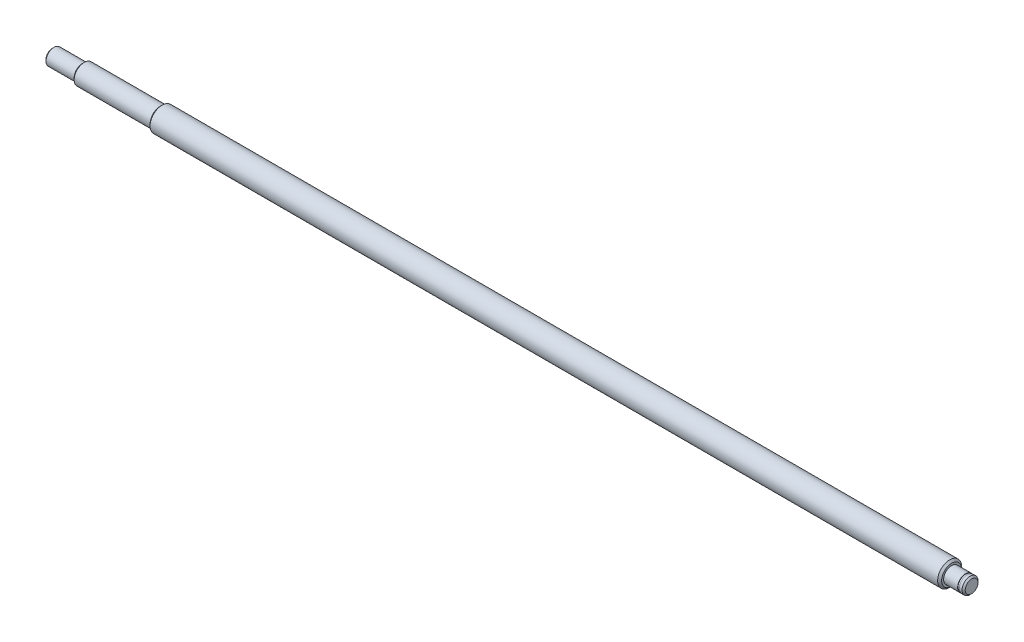
ISO-10303-21;
HEADER;
FILE_DESCRIPTION(('STEP AP214'),'2;1');
FILE_NAME('part.step','',(''),(''),'','','');
FILE_SCHEMA(('AUTOMOTIVE_DESIGN { 1 0 10303 214 1 1 1 1 }'));
ENDSEC;
DATA;
#1=APPLICATION_CONTEXT('core data for automotive mechanical design processes');
#2=APPLICATION_PROTOCOL_DEFINITION('international standard','automotive_design',2000,#1);
#3=PRODUCT_CONTEXT('',#1,'mechanical');
#4=PRODUCT('Part','Part','',(#3));
#5=PRODUCT_RELATED_PRODUCT_CATEGORY('part','',(#4));
#6=PRODUCT_DEFINITION_FORMATION('','',#4);
#7=PRODUCT_DEFINITION_CONTEXT('part definition',#1,'design');
#8=PRODUCT_DEFINITION('design','',#6,#7);
#9=PRODUCT_DEFINITION_SHAPE('','',#8);
#10=(LENGTH_UNIT() NAMED_UNIT(*) SI_UNIT(.MILLI.,.METRE.));
#11=(NAMED_UNIT(*) PLANE_ANGLE_UNIT() SI_UNIT($,.RADIAN.));
#12=(NAMED_UNIT(*) SI_UNIT($,.STERADIAN.) SOLID_ANGLE_UNIT());
#13=UNCERTAINTY_MEASURE_WITH_UNIT(LENGTH_MEASURE(1.E-05),#10,'distance_accuracy_value','');
#14=(GEOMETRIC_REPRESENTATION_CONTEXT(3) GLOBAL_UNCERTAINTY_ASSIGNED_CONTEXT((#13)) GLOBAL_UNIT_ASSIGNED_CONTEXT((#10,
#11,#12)) REPRESENTATION_CONTEXT('',''));
#15=CARTESIAN_POINT('',(0.,0.,0.));
#16=DIRECTION('',(0.,0.,1.));
#17=DIRECTION('',(1.,0.,0.));
#18=AXIS2_PLACEMENT_3D('',#15,#16,#17);
#19=CARTESIAN_POINT('',(-250.,0.,0.));
#20=DIRECTION('',(1.,0.,0.));
#21=DIRECTION('',(0.,1.,0.));
#22=AXIS2_PLACEMENT_3D('',#19,#20,#21);
#23=PLANE('',#22);
#24=CARTESIAN_POINT('',(-250.,0.,0.));
#25=DIRECTION('',(-1.,0.,0.));
#26=DIRECTION('',(0.,-1.,0.));
#27=AXIS2_PLACEMENT_3D('',#24,#25,#26);
#28=CIRCLE('',#27,3.19999999999995);
#29=CARTESIAN_POINT('',(-250.,-3.1999999999999,0.));
#30=VERTEX_POINT('',#29);
#31=EDGE_CURVE('E10',#30,#30,#28,.T.);
#32=ORIENTED_EDGE('',*,*,#31,.T.);
#33=EDGE_LOOP('',(#32));
#34=FACE_BOUND('',#33,.T.);
#35=ADVANCED_FACE('F30',(#34),#23,.F.);
#36=CARTESIAN_POINT('',(-249.2,0.,0.));
#37=DIRECTION('',(1.,0.,0.));
#38=DIRECTION('',(0.,1.,0.));
#39=AXIS2_PLACEMENT_3D('',#36,#37,#38);
#40=CONICAL_SURFACE('',#39,3.99999999999995,0.785398163397434);
#41=ORIENTED_EDGE('',*,*,#31,.F.);
#42=EDGE_LOOP('',(#41));
#43=FACE_BOUND('',#42,.T.);
#44=CARTESIAN_POINT('',(-249.2,0.,0.));
#45=DIRECTION('',(-1.,0.,0.));
#46=DIRECTION('',(0.,-1.,0.));
#47=AXIS2_PLACEMENT_3D('',#44,#45,#46);
#48=CIRCLE('',#47,3.99999999999995);
#49=CARTESIAN_POINT('',(-249.2,-3.9999999999999,0.));
#50=VERTEX_POINT('',#49);
#51=EDGE_CURVE('E36',#50,#50,#48,.T.);
#52=ORIENTED_EDGE('',*,*,#51,.T.);
#53=EDGE_LOOP('',(#52));
#54=FACE_BOUND('',#53,.T.);
#55=ADVANCED_FACE('F101',(#43,#54),#40,.T.);
#56=CARTESIAN_POINT('',(-511.970894611397,0.,0.));
#57=DIRECTION('',(-1.,0.,0.));
#58=DIRECTION('',(0.,-1.,0.));
#59=AXIS2_PLACEMENT_3D('',#56,#57,#58);
#60=CYLINDRICAL_SURFACE('',#59,3.99999999999995);
#61=ORIENTED_EDGE('',*,*,#51,.F.);
#62=EDGE_LOOP('',(#61));
#63=FACE_BOUND('',#62,.T.);
#64=CARTESIAN_POINT('',(-235.,0.,0.));
#65=DIRECTION('',(-1.,0.,0.));
#66=DIRECTION('',(0.,-1.,0.));
#67=AXIS2_PLACEMENT_3D('',#64,#65,#66);
#68=CIRCLE('',#67,3.99999999999995);
#69=CARTESIAN_POINT('',(-235.,-3.9999999999999,0.));
#70=VERTEX_POINT('',#69);
#71=EDGE_CURVE('E40',#70,#70,#68,.T.);
#72=ORIENTED_EDGE('',*,*,#71,.T.);
#73=EDGE_LOOP('',(#72));
#74=FACE_BOUND('',#73,.T.);
#75=ADVANCED_FACE('F105',(#63,#74),#60,.T.);
#76=CARTESIAN_POINT('',(-235.,4.,0.));
#77=DIRECTION('',(1.,0.,0.));
#78=DIRECTION('',(0.,1.,0.));
#79=AXIS2_PLACEMENT_3D('',#76,#77,#78);
#80=PLANE('',#79);
#81=ORIENTED_EDGE('',*,*,#71,.F.);
#82=EDGE_LOOP('',(#81));
#83=FACE_BOUND('',#82,.T.);
#84=CARTESIAN_POINT('',(-235.,0.,0.));
#85=DIRECTION('',(-1.,0.,0.));
#86=DIRECTION('',(0.,-1.,0.));
#87=AXIS2_PLACEMENT_3D('',#84,#85,#86);
#88=CIRCLE('',#87,4.09999999999995);
#89=CARTESIAN_POINT('',(-235.,-4.0999999999999,0.));
#90=VERTEX_POINT('',#89);
#91=EDGE_CURVE('E44',#90,#90,#88,.T.);
#92=ORIENTED_EDGE('',*,*,#91,.T.);
#93=EDGE_LOOP('',(#92));
#94=FACE_BOUND('',#93,.T.);
#95=ADVANCED_FACE('F110',(#83,#94),#80,.F.);
#96=CARTESIAN_POINT('',(-234.1,0.,0.));
#97=DIRECTION('',(1.,0.,0.));
#98=DIRECTION('',(0.,1.,0.));
#99=AXIS2_PLACEMENT_3D('',#96,#97,#98);
#100=CONICAL_SURFACE('',#99,4.99999999999995,0.785398163397442);
#101=ORIENTED_EDGE('',*,*,#91,.F.);
#102=EDGE_LOOP('',(#101));
#103=FACE_BOUND('',#102,.T.);
#104=CARTESIAN_POINT('',(-234.1,0.,0.));
#105=DIRECTION('',(-1.,0.,0.));
#106=DIRECTION('',(0.,-1.,0.));
#107=AXIS2_PLACEMENT_3D('',#104,#105,#106);
#108=CIRCLE('',#107,4.99999999999995);
#109=CARTESIAN_POINT('',(-234.1,-4.9999999999999,0.));
#110=VERTEX_POINT('',#109);
#111=EDGE_CURVE('E49',#110,#110,#108,.T.);
#112=ORIENTED_EDGE('',*,*,#111,.T.);
#113=EDGE_LOOP('',(#112));
#114=FACE_BOUND('',#113,.T.);
#115=ADVANCED_FACE('F116',(#103,#114),#100,.T.);
#116=CARTESIAN_POINT('',(-511.970894611397,0.,0.));
#117=DIRECTION('',(-1.,0.,0.));
#118=DIRECTION('',(0.,-1.,0.));
#119=AXIS2_PLACEMENT_3D('',#116,#117,#118);
#120=CYLINDRICAL_SURFACE('',#119,4.99999999999995);
#121=ORIENTED_EDGE('',*,*,#111,.F.);
#122=EDGE_LOOP('',(#121));
#123=FACE_BOUND('',#122,.T.);
#124=CARTESIAN_POINT('',(-196.,0.,0.));
#125=DIRECTION('',(-1.,0.,0.));
#126=DIRECTION('',(0.,-1.,0.));
#127=AXIS2_PLACEMENT_3D('',#124,#125,#126);
#128=CIRCLE('',#127,4.99999999999994);
#129=CARTESIAN_POINT('',(-196.,-4.99999999999988,0.));
#130=VERTEX_POINT('',#129);
#131=EDGE_CURVE('E52',#130,#130,#128,.T.);
#132=ORIENTED_EDGE('',*,*,#131,.T.);
#133=EDGE_LOOP('',(#132));
#134=FACE_BOUND('',#133,.T.);
#135=ADVANCED_FACE('F120',(#123,#134),#120,.T.);
#136=CARTESIAN_POINT('',(-196.,5.,0.));
#137=DIRECTION('',(1.,0.,0.));
#138=DIRECTION('',(0.,1.,0.));
#139=AXIS2_PLACEMENT_3D('',#136,#137,#138);
#140=PLANE('',#139);
#141=ORIENTED_EDGE('',*,*,#131,.F.);
#142=EDGE_LOOP('',(#141));
#143=FACE_BOUND('',#142,.T.);
#144=CARTESIAN_POINT('',(-196.,0.,0.));
#145=DIRECTION('',(-1.,0.,0.));
#146=DIRECTION('',(0.,-1.,0.));
#147=AXIS2_PLACEMENT_3D('',#144,#145,#146);
#148=CIRCLE('',#147,5.09999999999994);
#149=CARTESIAN_POINT('',(-196.,-5.09999999999988,0.));
#150=VERTEX_POINT('',#149);
#151=EDGE_CURVE('E55',#150,#150,#148,.T.);
#152=ORIENTED_EDGE('',*,*,#151,.T.);
#153=EDGE_LOOP('',(#152));
#154=FACE_BOUND('',#153,.T.);
#155=ADVANCED_FACE('F124',(#143,#154),#140,.F.);
#156=CARTESIAN_POINT('',(-195.1,0.,0.));
#157=DIRECTION('',(1.,0.,0.));
#158=DIRECTION('',(0.,1.,0.));
#159=AXIS2_PLACEMENT_3D('',#156,#157,#158);
#160=CONICAL_SURFACE('',#159,5.99999999999994,0.785398163397442);
#161=ORIENTED_EDGE('',*,*,#151,.F.);
#162=EDGE_LOOP('',(#161));
#163=FACE_BOUND('',#162,.T.);
#164=CARTESIAN_POINT('',(-195.1,0.,0.));
#165=DIRECTION('',(-1.,0.,0.));
#166=DIRECTION('',(0.,-1.,0.));
#167=AXIS2_PLACEMENT_3D('',#164,#165,#166);
#168=CIRCLE('',#167,5.99999999999994);
#169=CARTESIAN_POINT('',(-195.1,-5.99999999999988,0.));
#170=VERTEX_POINT('',#169);
#171=EDGE_CURVE('E58',#170,#170,#168,.T.);
#172=ORIENTED_EDGE('',*,*,#171,.T.);
#173=EDGE_LOOP('',(#172));
#174=FACE_BOUND('',#173,.T.);
#175=ADVANCED_FACE('F128',(#163,#174),#160,.T.);
#176=CARTESIAN_POINT('',(-511.970894611397,0.,0.));
#177=DIRECTION('',(-1.,0.,0.));
#178=DIRECTION('',(0.,-1.,0.));
#179=AXIS2_PLACEMENT_3D('',#176,#177,#178);
#180=CYLINDRICAL_SURFACE('',#179,5.99999999999991);
#181=ORIENTED_EDGE('',*,*,#171,.F.);
#182=EDGE_LOOP('',(#181));
#183=FACE_BOUND('',#182,.T.);
#184=CARTESIAN_POINT('',(199.,1.30733817571574E-13,0.));
#185=DIRECTION('',(-1.,0.,0.));
#186=DIRECTION('',(0.,-1.,0.));
#187=AXIS2_PLACEMENT_3D('',#184,#185,#186);
#188=CIRCLE('',#187,5.99999999999987);
#189=CARTESIAN_POINT('',(199.,-5.99999999999974,0.));
#190=VERTEX_POINT('',#189);
#191=EDGE_CURVE('E61',#190,#190,#188,.T.);
#192=ORIENTED_EDGE('',*,*,#191,.T.);
#193=EDGE_LOOP('',(#192));
#194=FACE_BOUND('',#193,.T.);
#195=ADVANCED_FACE('F132',(#183,#194),#180,.T.);
#196=CARTESIAN_POINT('',(200.,1.30917698260028E-13,0.));
#197=DIRECTION('',(-1.,0.,0.));
#198=DIRECTION('',(0.,-1.,0.));
#199=AXIS2_PLACEMENT_3D('',#196,#197,#198);
#200=CONICAL_SURFACE('',#199,4.99999999999987,0.785398163397446);
#201=ORIENTED_EDGE('',*,*,#191,.F.);
#202=EDGE_LOOP('',(#201));
#203=FACE_BOUND('',#202,.T.);
#204=CARTESIAN_POINT('',(200.,1.30917698260028E-13,0.));
#205=DIRECTION('',(-1.,0.,0.));
#206=DIRECTION('',(0.,-1.,0.));
#207=AXIS2_PLACEMENT_3D('',#204,#205,#206);
#208=CIRCLE('',#207,4.99999999999987);
#209=CARTESIAN_POINT('',(200.,-4.99999999999974,0.));
#210=VERTEX_POINT('',#209);
#211=EDGE_CURVE('E64',#210,#210,#208,.T.);
#212=ORIENTED_EDGE('',*,*,#211,.T.);
#213=EDGE_LOOP('',(#212));
#214=FACE_BOUND('',#213,.T.);
#215=ADVANCED_FACE('F136',(#203,#214),#200,.T.);
#216=CARTESIAN_POINT('',(200.,5.,0.));
#217=DIRECTION('',(-1.,0.,0.));
#218=DIRECTION('',(0.,-1.,0.));
#219=AXIS2_PLACEMENT_3D('',#216,#217,#218);
#220=PLANE('',#219);
#221=ORIENTED_EDGE('',*,*,#211,.F.);
#222=EDGE_LOOP('',(#221));
#223=FACE_BOUND('',#222,.T.);
#224=CARTESIAN_POINT('',(200.,1.30917698260028E-13,0.));
#225=DIRECTION('',(-1.,0.,0.));
#226=DIRECTION('',(0.,-1.,0.));
#227=AXIS2_PLACEMENT_3D('',#224,#225,#226);
#228=CIRCLE('',#227,3.99999999999987);
#229=CARTESIAN_POINT('',(200.,-3.99999999999974,0.));
#230=VERTEX_POINT('',#229);
#231=EDGE_CURVE('E67',#230,#230,#228,.T.);
#232=ORIENTED_EDGE('',*,*,#231,.T.);
#233=EDGE_LOOP('',(#232));
#234=FACE_BOUND('',#233,.T.);
#235=ADVANCED_FACE('F140',(#223,#234),#220,.F.);
#236=CARTESIAN_POINT('',(-511.970894611397,0.,0.));
#237=DIRECTION('',(-1.,0.,0.));
#238=DIRECTION('',(0.,-1.,0.));
#239=AXIS2_PLACEMENT_3D('',#236,#237,#238);
#240=CYLINDRICAL_SURFACE('',#239,3.99999999999987);
#241=ORIENTED_EDGE('',*,*,#231,.F.);
#242=EDGE_LOOP('',(#241));
#243=FACE_BOUND('',#242,.T.);
#244=CARTESIAN_POINT('',(207.,1.32204863079202E-13,0.));
#245=DIRECTION('',(-1.,0.,0.));
#246=DIRECTION('',(0.,-1.,0.));
#247=AXIS2_PLACEMENT_3D('',#244,#245,#246);
#248=CIRCLE('',#247,3.99999999999987);
#249=CARTESIAN_POINT('',(207.,-3.99999999999974,0.));
#250=VERTEX_POINT('',#249);
#251=EDGE_CURVE('E70',#250,#250,#248,.T.);
#252=ORIENTED_EDGE('',*,*,#251,.T.);
#253=EDGE_LOOP('',(#252));
#254=FACE_BOUND('',#253,.T.);
#255=ADVANCED_FACE('F144',(#243,#254),#240,.T.);
#256=CARTESIAN_POINT('',(207.,4.,0.));
#257=DIRECTION('',(-1.,0.,0.));
#258=DIRECTION('',(0.,-1.,0.));
#259=AXIS2_PLACEMENT_3D('',#256,#257,#258);
#260=PLANE('',#259);
#261=ORIENTED_EDGE('',*,*,#251,.F.);
#262=EDGE_LOOP('',(#261));
#263=FACE_BOUND('',#262,.T.);
#264=CARTESIAN_POINT('',(207.,1.32204863079202E-13,0.));
#265=DIRECTION('',(-1.,0.,0.));
#266=DIRECTION('',(0.,-1.,0.));
#267=AXIS2_PLACEMENT_3D('',#264,#265,#266);
#268=CIRCLE('',#267,3.79999999999987);
#269=CARTESIAN_POINT('',(207.,-3.79999999999974,0.));
#270=VERTEX_POINT('',#269);
#271=EDGE_CURVE('E73',#270,#270,#268,.T.);
#272=ORIENTED_EDGE('',*,*,#271,.T.);
#273=EDGE_LOOP('',(#272));
#274=FACE_BOUND('',#273,.T.);
#275=ADVANCED_FACE('F148',(#263,#274),#260,.F.);
#276=CARTESIAN_POINT('',(-511.970894611397,0.,0.));
#277=DIRECTION('',(-1.,0.,0.));
#278=DIRECTION('',(0.,-1.,0.));
#279=AXIS2_PLACEMENT_3D('',#276,#277,#278);
#280=CYLINDRICAL_SURFACE('',#279,3.79999999999987);
#281=ORIENTED_EDGE('',*,*,#271,.F.);
#282=EDGE_LOOP('',(#281));
#283=FACE_BOUND('',#282,.T.);
#284=CARTESIAN_POINT('',(207.9,1.32370355698811E-13,0.));
#285=DIRECTION('',(-1.,0.,0.));
#286=DIRECTION('',(0.,-1.,0.));
#287=AXIS2_PLACEMENT_3D('',#284,#285,#286);
#288=CIRCLE('',#287,3.79999999999987);
#289=CARTESIAN_POINT('',(207.9,-3.79999999999974,0.));
#290=VERTEX_POINT('',#289);
#291=EDGE_CURVE('E76',#290,#290,#288,.T.);
#292=ORIENTED_EDGE('',*,*,#291,.T.);
#293=EDGE_LOOP('',(#292));
#294=FACE_BOUND('',#293,.T.);
#295=ADVANCED_FACE('F152',(#283,#294),#280,.T.);
#296=CARTESIAN_POINT('',(207.9,3.8,0.));
#297=DIRECTION('',(1.,0.,0.));
#298=DIRECTION('',(0.,1.,0.));
#299=AXIS2_PLACEMENT_3D('',#296,#297,#298);
#300=PLANE('',#299);
#301=ORIENTED_EDGE('',*,*,#291,.F.);
#302=EDGE_LOOP('',(#301));
#303=FACE_BOUND('',#302,.T.);
#304=CARTESIAN_POINT('',(207.9,1.32370355698811E-13,0.));
#305=DIRECTION('',(-1.,0.,0.));
#306=DIRECTION('',(0.,-1.,0.));
#307=AXIS2_PLACEMENT_3D('',#304,#305,#306);
#308=CIRCLE('',#307,3.99999999999987);
#309=CARTESIAN_POINT('',(207.9,-3.99999999999973,0.));
#310=VERTEX_POINT('',#309);
#311=EDGE_CURVE('E79',#310,#310,#308,.T.);
#312=ORIENTED_EDGE('',*,*,#311,.T.);
#313=EDGE_LOOP('',(#312));
#314=FACE_BOUND('',#313,.T.);
#315=ADVANCED_FACE('F156',(#303,#314),#300,.F.);
#316=CARTESIAN_POINT('',(-511.970894611397,0.,0.));
#317=DIRECTION('',(-1.,0.,0.));
#318=DIRECTION('',(0.,-1.,0.));
#319=AXIS2_PLACEMENT_3D('',#316,#317,#318);
#320=CYLINDRICAL_SURFACE('',#319,3.99999999999987);
#321=ORIENTED_EDGE('',*,*,#311,.F.);
#322=EDGE_LOOP('',(#321));
#323=FACE_BOUND('',#322,.T.);
#324=CARTESIAN_POINT('',(209.2,1.326094005938E-13,0.));
#325=DIRECTION('',(-1.,0.,0.));
#326=DIRECTION('',(0.,-1.,0.));
#327=AXIS2_PLACEMENT_3D('',#324,#325,#326);
#328=CIRCLE('',#327,3.99999999999987);
#329=CARTESIAN_POINT('',(209.2,-3.99999999999973,0.));
#330=VERTEX_POINT('',#329);
#331=EDGE_CURVE('E82',#330,#330,#328,.T.);
#332=ORIENTED_EDGE('',*,*,#331,.T.);
#333=EDGE_LOOP('',(#332));
#334=FACE_BOUND('',#333,.T.);
#335=ADVANCED_FACE('F97',(#323,#334),#320,.T.);
#336=CARTESIAN_POINT('',(210.,1.32756505144563E-13,0.));
#337=DIRECTION('',(-1.,0.,0.));
#338=DIRECTION('',(0.,-1.,0.));
#339=AXIS2_PLACEMENT_3D('',#336,#337,#338);
#340=CONICAL_SURFACE('',#339,3.19999999999988,0.785398163397428);
#341=ORIENTED_EDGE('',*,*,#331,.F.);
#342=EDGE_LOOP('',(#341));
#343=FACE_BOUND('',#342,.T.);
#344=CARTESIAN_POINT('',(210.,1.32756505144563E-13,0.));
#345=DIRECTION('',(-1.,0.,0.));
#346=DIRECTION('',(0.,-1.,0.));
#347=AXIS2_PLACEMENT_3D('',#344,#345,#346);
#348=CIRCLE('',#347,3.19999999999988);
#349=CARTESIAN_POINT('',(210.,-3.19999999999974,0.));
#350=VERTEX_POINT('',#349);
#351=EDGE_CURVE('E85',#350,#350,#348,.T.);
#352=ORIENTED_EDGE('',*,*,#351,.T.);
#353=EDGE_LOOP('',(#352));
#354=FACE_BOUND('',#353,.T.);
#355=ADVANCED_FACE('F89',(#343,#354),#340,.T.);
#356=CARTESIAN_POINT('',(210.,3.20000000000001,0.));
#357=DIRECTION('',(-1.,0.,0.));
#358=DIRECTION('',(0.,-1.,0.));
#359=AXIS2_PLACEMENT_3D('',#356,#357,#358);
#360=PLANE('',#359);
#361=ORIENTED_EDGE('',*,*,#351,.F.);
#362=EDGE_LOOP('',(#361));
#363=FACE_BOUND('',#362,.T.);
#364=ADVANCED_FACE('F91',(#363),#360,.F.);
#365=CLOSED_SHELL('',(#35,#55,#75,#95,#115,#135,#155,#175,#195,#215,#235,#255,#275,#295,#315,
#335,#355,#364));
#366=MANIFOLD_SOLID_BREP('B2',#365);
#367=ADVANCED_BREP_SHAPE_REPRESENTATION('',(#18,#366),#14);
#368=SHAPE_DEFINITION_REPRESENTATION(#9,#367);
ENDSEC;
END-ISO-10303-21;
